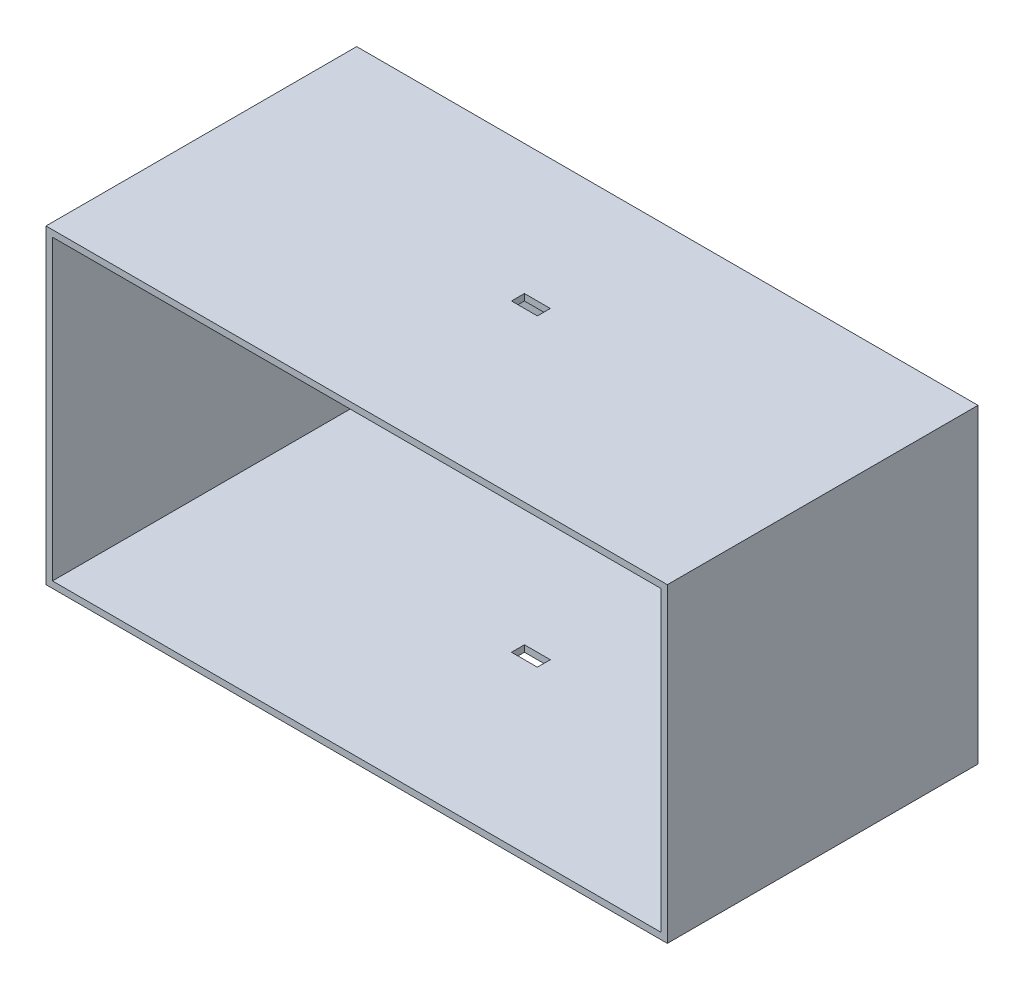
ISO-10303-21;
HEADER;
FILE_DESCRIPTION(('STEP AP214'),'2;1');
FILE_NAME('part.step','',(''),(''),'','','');
FILE_SCHEMA(('AUTOMOTIVE_DESIGN { 1 0 10303 214 1 1 1 1 }'));
ENDSEC;
DATA;
#1=APPLICATION_CONTEXT('core data for automotive mechanical design processes');
#2=APPLICATION_PROTOCOL_DEFINITION('international standard','automotive_design',2000,#1);
#3=PRODUCT_CONTEXT('',#1,'mechanical');
#4=PRODUCT('Part','Part','',(#3));
#5=PRODUCT_RELATED_PRODUCT_CATEGORY('part','',(#4));
#6=PRODUCT_DEFINITION_FORMATION('','',#4);
#7=PRODUCT_DEFINITION_CONTEXT('part definition',#1,'design');
#8=PRODUCT_DEFINITION('design','',#6,#7);
#9=PRODUCT_DEFINITION_SHAPE('','',#8);
#10=(LENGTH_UNIT() NAMED_UNIT(*) SI_UNIT(.MILLI.,.METRE.));
#11=(NAMED_UNIT(*) PLANE_ANGLE_UNIT() SI_UNIT($,.RADIAN.));
#12=(NAMED_UNIT(*) SI_UNIT($,.STERADIAN.) SOLID_ANGLE_UNIT());
#13=UNCERTAINTY_MEASURE_WITH_UNIT(LENGTH_MEASURE(1.E-05),#10,'distance_accuracy_value','');
#14=(GEOMETRIC_REPRESENTATION_CONTEXT(3) GLOBAL_UNCERTAINTY_ASSIGNED_CONTEXT((#13)) GLOBAL_UNIT_ASSIGNED_CONTEXT((#10,
#11,#12)) REPRESENTATION_CONTEXT('',''));
#15=CARTESIAN_POINT('',(0.,0.,0.));
#16=DIRECTION('',(0.,0.,1.));
#17=DIRECTION('',(1.,0.,0.));
#18=AXIS2_PLACEMENT_3D('',#15,#16,#17);
#19=CARTESIAN_POINT('',(0.,0.,152.4));
#20=DIRECTION('',(0.,0.,-1.));
#21=DIRECTION('',(-1.,0.,0.));
#22=AXIS2_PLACEMENT_3D('',#19,#20,#21);
#23=PLANE('',#22);
#24=DIRECTION('',(0.,-1.,0.));
#25=VECTOR('',#24,1.);
#26=CARTESIAN_POINT('',(0.,0.,152.4));
#27=LINE('',#26,#25);
#28=CARTESIAN_POINT('',(0.,152.4,152.4));
#29=VERTEX_POINT('',#28);
#30=CARTESIAN_POINT('',(0.,0.,152.4));
#31=VERTEX_POINT('',#30);
#32=EDGE_CURVE('E272',#29,#31,#27,.T.);
#33=ORIENTED_EDGE('',*,*,#32,.T.);
#34=DIRECTION('',(1.,0.,0.));
#35=VECTOR('',#34,1.);
#36=CARTESIAN_POINT('',(0.,0.,152.4));
#37=LINE('',#36,#35);
#38=CARTESIAN_POINT('',(304.8,0.,152.4));
#39=VERTEX_POINT('',#38);
#40=EDGE_CURVE('E280',#31,#39,#37,.T.);
#41=ORIENTED_EDGE('',*,*,#40,.T.);
#42=DIRECTION('',(0.,1.,0.));
#43=VECTOR('',#42,1.);
#44=CARTESIAN_POINT('',(304.8,0.,152.4));
#45=LINE('',#44,#43);
#46=CARTESIAN_POINT('',(304.8,152.4,152.4));
#47=VERTEX_POINT('',#46);
#48=EDGE_CURVE('E282',#39,#47,#45,.T.);
#49=ORIENTED_EDGE('',*,*,#48,.T.);
#50=DIRECTION('',(-1.,0.,0.));
#51=VECTOR('',#50,1.);
#52=CARTESIAN_POINT('',(0.,152.4,152.4));
#53=LINE('',#52,#51);
#54=EDGE_CURVE('E281',#47,#29,#53,.T.);
#55=ORIENTED_EDGE('',*,*,#54,.T.);
#56=EDGE_LOOP('',(#33,#41,#49,#55));
#57=FACE_BOUND('',#56,.T.);
#58=DIRECTION('',(0.,-1.,0.));
#59=VECTOR('',#58,1.);
#60=CARTESIAN_POINT('',(3.175,0.,152.4));
#61=LINE('',#60,#59);
#62=CARTESIAN_POINT('',(3.175,149.225,152.4));
#63=VERTEX_POINT('',#62);
#64=CARTESIAN_POINT('',(3.175,3.175,152.4));
#65=VERTEX_POINT('',#64);
#66=EDGE_CURVE('E261',#63,#65,#61,.T.);
#67=ORIENTED_EDGE('',*,*,#66,.F.);
#68=DIRECTION('',(-1.,0.,0.));
#69=VECTOR('',#68,1.);
#70=CARTESIAN_POINT('',(0.,149.225,152.4));
#71=LINE('',#70,#69);
#72=CARTESIAN_POINT('',(301.625,149.225,152.4));
#73=VERTEX_POINT('',#72);
#74=EDGE_CURVE('E247',#73,#63,#71,.T.);
#75=ORIENTED_EDGE('',*,*,#74,.F.);
#76=DIRECTION('',(0.,1.,0.));
#77=VECTOR('',#76,1.);
#78=CARTESIAN_POINT('',(301.625,0.,152.4));
#79=LINE('',#78,#77);
#80=CARTESIAN_POINT('',(301.625,3.175,152.4));
#81=VERTEX_POINT('',#80);
#82=EDGE_CURVE('E270',#81,#73,#79,.T.);
#83=ORIENTED_EDGE('',*,*,#82,.F.);
#84=DIRECTION('',(1.,0.,0.));
#85=VECTOR('',#84,1.);
#86=CARTESIAN_POINT('',(0.,3.175,152.4));
#87=LINE('',#86,#85);
#88=EDGE_CURVE('E262',#65,#81,#87,.T.);
#89=ORIENTED_EDGE('',*,*,#88,.F.);
#90=EDGE_LOOP('',(#67,#75,#83,#89));
#91=FACE_BOUND('',#90,.T.);
#92=ADVANCED_FACE('F44',(#57,#91),#23,.F.);
#93=CARTESIAN_POINT('',(0.,0.,152.4));
#94=DIRECTION('',(1.,0.,0.));
#95=DIRECTION('',(0.,0.,-1.));
#96=AXIS2_PLACEMENT_3D('',#93,#94,#95);
#97=PLANE('',#96);
#98=DIRECTION('',(0.,-1.,0.));
#99=VECTOR('',#98,1.);
#100=CARTESIAN_POINT('',(0.,0.,0.));
#101=LINE('',#100,#99);
#102=CARTESIAN_POINT('',(0.,152.4,0.));
#103=VERTEX_POINT('',#102);
#104=CARTESIAN_POINT('',(0.,0.,0.));
#105=VERTEX_POINT('',#104);
#106=EDGE_CURVE('E239',#103,#105,#101,.T.);
#107=ORIENTED_EDGE('',*,*,#106,.T.);
#108=DIRECTION('',(0.,0.,-1.));
#109=VECTOR('',#108,1.);
#110=CARTESIAN_POINT('',(0.,0.,152.4));
#111=LINE('',#110,#109);
#112=EDGE_CURVE('E309',#31,#105,#111,.T.);
#113=ORIENTED_EDGE('',*,*,#112,.F.);
#114=ORIENTED_EDGE('',*,*,#32,.F.);
#115=DIRECTION('',(0.,0.,-1.));
#116=VECTOR('',#115,1.);
#117=CARTESIAN_POINT('',(0.,152.4,152.4));
#118=LINE('',#117,#116);
#119=EDGE_CURVE('E290',#29,#103,#118,.T.);
#120=ORIENTED_EDGE('',*,*,#119,.T.);
#121=EDGE_LOOP('',(#107,#113,#114,#120));
#122=FACE_BOUND('',#121,.T.);
#123=ADVANCED_FACE('F50',(#122),#97,.F.);
#124=CARTESIAN_POINT('',(0.,0.,152.4));
#125=DIRECTION('',(0.,1.,0.));
#126=DIRECTION('',(0.,0.,1.));
#127=AXIS2_PLACEMENT_3D('',#124,#125,#126);
#128=PLANE('',#127);
#129=DIRECTION('',(1.,0.,0.));
#130=VECTOR('',#129,1.);
#131=CARTESIAN_POINT('',(146.05,0.,63.754));
#132=LINE('',#131,#130);
#133=CARTESIAN_POINT('',(146.05,0.,63.754));
#134=VERTEX_POINT('',#133);
#135=CARTESIAN_POINT('',(158.75,0.,63.754));
#136=VERTEX_POINT('',#135);
#137=EDGE_CURVE('E200',#134,#136,#132,.T.);
#138=ORIENTED_EDGE('',*,*,#137,.F.);
#139=DIRECTION('',(0.,0.,-1.));
#140=VECTOR('',#139,1.);
#141=CARTESIAN_POINT('',(146.05,0.,70.104));
#142=LINE('',#141,#140);
#143=CARTESIAN_POINT('',(146.05,0.,70.104));
#144=VERTEX_POINT('',#143);
#145=EDGE_CURVE('E62',#144,#134,#142,.T.);
#146=ORIENTED_EDGE('',*,*,#145,.F.);
#147=DIRECTION('',(-1.,0.,0.));
#148=VECTOR('',#147,1.);
#149=CARTESIAN_POINT('',(146.05,0.,70.104));
#150=LINE('',#149,#148);
#151=CARTESIAN_POINT('',(158.75,0.,70.104));
#152=VERTEX_POINT('',#151);
#153=EDGE_CURVE('E187',#152,#144,#150,.T.);
#154=ORIENTED_EDGE('',*,*,#153,.F.);
#155=DIRECTION('',(0.,0.,1.));
#156=VECTOR('',#155,1.);
#157=CARTESIAN_POINT('',(158.75,0.,70.104));
#158=LINE('',#157,#156);
#159=EDGE_CURVE('E188',#136,#152,#158,.T.);
#160=ORIENTED_EDGE('',*,*,#159,.F.);
#161=EDGE_LOOP('',(#138,#146,#154,#160));
#162=FACE_BOUND('',#161,.T.);
#163=DIRECTION('',(1.,0.,0.));
#164=VECTOR('',#163,1.);
#165=CARTESIAN_POINT('',(0.,0.,0.));
#166=LINE('',#165,#164);
#167=CARTESIAN_POINT('',(304.8,0.,0.));
#168=VERTEX_POINT('',#167);
#169=EDGE_CURVE('E292',#105,#168,#166,.T.);
#170=ORIENTED_EDGE('',*,*,#169,.T.);
#171=DIRECTION('',(0.,0.,-1.));
#172=VECTOR('',#171,1.);
#173=CARTESIAN_POINT('',(304.8,0.,152.4));
#174=LINE('',#173,#172);
#175=EDGE_CURVE('E308',#39,#168,#174,.T.);
#176=ORIENTED_EDGE('',*,*,#175,.F.);
#177=ORIENTED_EDGE('',*,*,#40,.F.);
#178=ORIENTED_EDGE('',*,*,#112,.T.);
#179=EDGE_LOOP('',(#170,#176,#177,#178));
#180=FACE_BOUND('',#179,.T.);
#181=ADVANCED_FACE('F348',(#162,#180),#128,.F.);
#182=CARTESIAN_POINT('',(304.8,0.,152.4));
#183=DIRECTION('',(-1.,0.,0.));
#184=DIRECTION('',(0.,0.,1.));
#185=AXIS2_PLACEMENT_3D('',#182,#183,#184);
#186=PLANE('',#185);
#187=DIRECTION('',(0.,1.,0.));
#188=VECTOR('',#187,1.);
#189=CARTESIAN_POINT('',(304.8,0.,0.));
#190=LINE('',#189,#188);
#191=CARTESIAN_POINT('',(304.8,152.4,0.));
#192=VERTEX_POINT('',#191);
#193=EDGE_CURVE('E294',#168,#192,#190,.T.);
#194=ORIENTED_EDGE('',*,*,#193,.T.);
#195=DIRECTION('',(0.,0.,-1.));
#196=VECTOR('',#195,1.);
#197=CARTESIAN_POINT('',(304.8,152.4,152.4));
#198=LINE('',#197,#196);
#199=EDGE_CURVE('E305',#47,#192,#198,.T.);
#200=ORIENTED_EDGE('',*,*,#199,.F.);
#201=ORIENTED_EDGE('',*,*,#48,.F.);
#202=ORIENTED_EDGE('',*,*,#175,.T.);
#203=EDGE_LOOP('',(#194,#200,#201,#202));
#204=FACE_BOUND('',#203,.T.);
#205=ADVANCED_FACE('F362',(#204),#186,.F.);
#206=CARTESIAN_POINT('',(0.,152.4,152.4));
#207=DIRECTION('',(0.,-1.,0.));
#208=DIRECTION('',(0.,0.,-1.));
#209=AXIS2_PLACEMENT_3D('',#206,#207,#208);
#210=PLANE('',#209);
#211=DIRECTION('',(-1.,0.,0.));
#212=VECTOR('',#211,1.);
#213=CARTESIAN_POINT('',(146.05,152.4,70.104));
#214=LINE('',#213,#212);
#215=CARTESIAN_POINT('',(158.75,152.4,70.104));
#216=VERTEX_POINT('',#215);
#217=CARTESIAN_POINT('',(146.05,152.4,70.104));
#218=VERTEX_POINT('',#217);
#219=EDGE_CURVE('E184',#216,#218,#214,.T.);
#220=ORIENTED_EDGE('',*,*,#219,.T.);
#221=DIRECTION('',(0.,0.,-1.));
#222=VECTOR('',#221,1.);
#223=CARTESIAN_POINT('',(146.05,152.4,70.104));
#224=LINE('',#223,#222);
#225=CARTESIAN_POINT('',(146.05,152.4,63.754));
#226=VERTEX_POINT('',#225);
#227=EDGE_CURVE('E164',#218,#226,#224,.T.);
#228=ORIENTED_EDGE('',*,*,#227,.T.);
#229=DIRECTION('',(1.,0.,0.));
#230=VECTOR('',#229,1.);
#231=CARTESIAN_POINT('',(146.05,152.4,63.754));
#232=LINE('',#231,#230);
#233=CARTESIAN_POINT('',(158.75,152.4,63.754));
#234=VERTEX_POINT('',#233);
#235=EDGE_CURVE('E173',#226,#234,#232,.T.);
#236=ORIENTED_EDGE('',*,*,#235,.T.);
#237=DIRECTION('',(0.,0.,1.));
#238=VECTOR('',#237,1.);
#239=CARTESIAN_POINT('',(158.75,152.4,70.104));
#240=LINE('',#239,#238);
#241=EDGE_CURVE('E69',#234,#216,#240,.T.);
#242=ORIENTED_EDGE('',*,*,#241,.T.);
#243=EDGE_LOOP('',(#220,#228,#236,#242));
#244=FACE_BOUND('',#243,.T.);
#245=DIRECTION('',(-1.,0.,0.));
#246=VECTOR('',#245,1.);
#247=CARTESIAN_POINT('',(0.,152.4,0.));
#248=LINE('',#247,#246);
#249=EDGE_CURVE('E279',#192,#103,#248,.T.);
#250=ORIENTED_EDGE('',*,*,#249,.T.);
#251=ORIENTED_EDGE('',*,*,#119,.F.);
#252=ORIENTED_EDGE('',*,*,#54,.F.);
#253=ORIENTED_EDGE('',*,*,#199,.T.);
#254=EDGE_LOOP('',(#250,#251,#252,#253));
#255=FACE_BOUND('',#254,.T.);
#256=ADVANCED_FACE('F182',(#244,#255),#210,.F.);
#257=CARTESIAN_POINT('',(0.,0.,0.));
#258=DIRECTION('',(0.,0.,-1.));
#259=DIRECTION('',(-1.,0.,0.));
#260=AXIS2_PLACEMENT_3D('',#257,#258,#259);
#261=PLANE('',#260);
#262=ORIENTED_EDGE('',*,*,#106,.F.);
#263=ORIENTED_EDGE('',*,*,#249,.F.);
#264=ORIENTED_EDGE('',*,*,#193,.F.);
#265=ORIENTED_EDGE('',*,*,#169,.F.);
#266=EDGE_LOOP('',(#262,#263,#264,#265));
#267=FACE_BOUND('',#266,.T.);
#268=ADVANCED_FACE('F357',(#267),#261,.T.);
#269=CARTESIAN_POINT('',(3.175,0.,152.4));
#270=DIRECTION('',(1.,0.,0.));
#271=DIRECTION('',(0.,0.,-1.));
#272=AXIS2_PLACEMENT_3D('',#269,#270,#271);
#273=PLANE('',#272);
#274=DIRECTION('',(0.,-1.,0.));
#275=VECTOR('',#274,1.);
#276=CARTESIAN_POINT('',(3.175,0.,3.175));
#277=LINE('',#276,#275);
#278=CARTESIAN_POINT('',(3.175,149.225,3.175));
#279=VERTEX_POINT('',#278);
#280=CARTESIAN_POINT('',(3.175,3.175,3.175));
#281=VERTEX_POINT('',#280);
#282=EDGE_CURVE('E228',#279,#281,#277,.T.);
#283=ORIENTED_EDGE('',*,*,#282,.F.);
#284=DIRECTION('',(0.,0.,-1.));
#285=VECTOR('',#284,1.);
#286=CARTESIAN_POINT('',(3.175,149.225,152.4));
#287=LINE('',#286,#285);
#288=EDGE_CURVE('E242',#63,#279,#287,.T.);
#289=ORIENTED_EDGE('',*,*,#288,.F.);
#290=ORIENTED_EDGE('',*,*,#66,.T.);
#291=DIRECTION('',(0.,0.,-1.));
#292=VECTOR('',#291,1.);
#293=CARTESIAN_POINT('',(3.175,3.175,152.4));
#294=LINE('',#293,#292);
#295=EDGE_CURVE('E231',#65,#281,#294,.T.);
#296=ORIENTED_EDGE('',*,*,#295,.T.);
#297=EDGE_LOOP('',(#283,#289,#290,#296));
#298=FACE_BOUND('',#297,.T.);
#299=ADVANCED_FACE('F358',(#298),#273,.T.);
#300=CARTESIAN_POINT('',(0.,3.175,152.4));
#301=DIRECTION('',(0.,1.,0.));
#302=DIRECTION('',(0.,0.,1.));
#303=AXIS2_PLACEMENT_3D('',#300,#301,#302);
#304=PLANE('',#303);
#305=DIRECTION('',(0.,0.,1.));
#306=VECTOR('',#305,1.);
#307=CARTESIAN_POINT('',(146.05,3.175,152.399999999999));
#308=LINE('',#307,#306);
#309=CARTESIAN_POINT('',(146.05,3.17500000000007,63.754));
#310=VERTEX_POINT('',#309);
#311=CARTESIAN_POINT('',(146.05,3.17500000000007,70.104));
#312=VERTEX_POINT('',#311);
#313=EDGE_CURVE('E230',#310,#312,#308,.T.);
#314=ORIENTED_EDGE('',*,*,#313,.F.);
#315=DIRECTION('',(-1.,0.,0.));
#316=VECTOR('',#315,1.);
#317=CARTESIAN_POINT('',(0.,3.175,63.754));
#318=LINE('',#317,#316);
#319=CARTESIAN_POINT('',(158.75,3.175,63.754));
#320=VERTEX_POINT('',#319);
#321=EDGE_CURVE('E207',#320,#310,#318,.T.);
#322=ORIENTED_EDGE('',*,*,#321,.F.);
#323=DIRECTION('',(0.,0.,-1.));
#324=VECTOR('',#323,1.);
#325=CARTESIAN_POINT('',(158.75,3.175,152.400000000001));
#326=LINE('',#325,#324);
#327=CARTESIAN_POINT('',(158.75,3.17500000000007,70.104));
#328=VERTEX_POINT('',#327);
#329=EDGE_CURVE('E219',#328,#320,#326,.T.);
#330=ORIENTED_EDGE('',*,*,#329,.F.);
#331=DIRECTION('',(1.,0.,0.));
#332=VECTOR('',#331,1.);
#333=CARTESIAN_POINT('',(0.,3.175,70.104));
#334=LINE('',#333,#332);
#335=EDGE_CURVE('E221',#312,#328,#334,.T.);
#336=ORIENTED_EDGE('',*,*,#335,.F.);
#337=EDGE_LOOP('',(#314,#322,#330,#336));
#338=FACE_BOUND('',#337,.T.);
#339=DIRECTION('',(1.,0.,0.));
#340=VECTOR('',#339,1.);
#341=CARTESIAN_POINT('',(0.,3.175,3.175));
#342=LINE('',#341,#340);
#343=CARTESIAN_POINT('',(301.625,3.175,3.175));
#344=VERTEX_POINT('',#343);
#345=EDGE_CURVE('E234',#281,#344,#342,.T.);
#346=ORIENTED_EDGE('',*,*,#345,.F.);
#347=ORIENTED_EDGE('',*,*,#295,.F.);
#348=ORIENTED_EDGE('',*,*,#88,.T.);
#349=DIRECTION('',(0.,0.,-1.));
#350=VECTOR('',#349,1.);
#351=CARTESIAN_POINT('',(301.625,3.175,152.4));
#352=LINE('',#351,#350);
#353=EDGE_CURVE('E238',#81,#344,#352,.T.);
#354=ORIENTED_EDGE('',*,*,#353,.T.);
#355=EDGE_LOOP('',(#346,#347,#348,#354));
#356=FACE_BOUND('',#355,.T.);
#357=ADVANCED_FACE('F398',(#338,#356),#304,.T.);
#358=CARTESIAN_POINT('',(301.625,0.,152.4));
#359=DIRECTION('',(-1.,0.,0.));
#360=DIRECTION('',(0.,0.,1.));
#361=AXIS2_PLACEMENT_3D('',#358,#359,#360);
#362=PLANE('',#361);
#363=DIRECTION('',(0.,1.,0.));
#364=VECTOR('',#363,1.);
#365=CARTESIAN_POINT('',(301.625,0.,3.175));
#366=LINE('',#365,#364);
#367=CARTESIAN_POINT('',(301.625,149.225,3.175));
#368=VERTEX_POINT('',#367);
#369=EDGE_CURVE('E249',#344,#368,#366,.T.);
#370=ORIENTED_EDGE('',*,*,#369,.F.);
#371=ORIENTED_EDGE('',*,*,#353,.F.);
#372=ORIENTED_EDGE('',*,*,#82,.T.);
#373=DIRECTION('',(0.,0.,-1.));
#374=VECTOR('',#373,1.);
#375=CARTESIAN_POINT('',(301.625,149.225,152.4));
#376=LINE('',#375,#374);
#377=EDGE_CURVE('E243',#73,#368,#376,.T.);
#378=ORIENTED_EDGE('',*,*,#377,.T.);
#379=EDGE_LOOP('',(#370,#371,#372,#378));
#380=FACE_BOUND('',#379,.T.);
#381=ADVANCED_FACE('F402',(#380),#362,.T.);
#382=CARTESIAN_POINT('',(0.,149.225,152.4));
#383=DIRECTION('',(0.,-1.,0.));
#384=DIRECTION('',(0.,0.,-1.));
#385=AXIS2_PLACEMENT_3D('',#382,#383,#384);
#386=PLANE('',#385);
#387=DIRECTION('',(0.,0.,-1.));
#388=VECTOR('',#387,1.);
#389=CARTESIAN_POINT('',(146.05,149.225,152.399999999999));
#390=LINE('',#389,#388);
#391=CARTESIAN_POINT('',(146.05,149.225,70.104));
#392=VERTEX_POINT('',#391);
#393=CARTESIAN_POINT('',(146.05,149.225,63.754));
#394=VERTEX_POINT('',#393);
#395=EDGE_CURVE('E11',#392,#394,#390,.T.);
#396=ORIENTED_EDGE('',*,*,#395,.F.);
#397=DIRECTION('',(-1.,0.,0.));
#398=VECTOR('',#397,1.);
#399=CARTESIAN_POINT('',(0.,149.225,70.104));
#400=LINE('',#399,#398);
#401=CARTESIAN_POINT('',(158.75,149.225,70.104));
#402=VERTEX_POINT('',#401);
#403=EDGE_CURVE('E53',#402,#392,#400,.T.);
#404=ORIENTED_EDGE('',*,*,#403,.F.);
#405=DIRECTION('',(0.,0.,1.));
#406=VECTOR('',#405,1.);
#407=CARTESIAN_POINT('',(158.75,149.225,152.400000000001));
#408=LINE('',#407,#406);
#409=CARTESIAN_POINT('',(158.75,149.225,63.754));
#410=VERTEX_POINT('',#409);
#411=EDGE_CURVE('E320',#410,#402,#408,.T.);
#412=ORIENTED_EDGE('',*,*,#411,.F.);
#413=DIRECTION('',(1.,0.,0.));
#414=VECTOR('',#413,1.);
#415=CARTESIAN_POINT('',(0.,149.225,63.754));
#416=LINE('',#415,#414);
#417=EDGE_CURVE('E314',#394,#410,#416,.T.);
#418=ORIENTED_EDGE('',*,*,#417,.F.);
#419=EDGE_LOOP('',(#396,#404,#412,#418));
#420=FACE_BOUND('',#419,.T.);
#421=DIRECTION('',(-1.,0.,0.));
#422=VECTOR('',#421,1.);
#423=CARTESIAN_POINT('',(0.,149.225,3.175));
#424=LINE('',#423,#422);
#425=EDGE_CURVE('E254',#368,#279,#424,.T.);
#426=ORIENTED_EDGE('',*,*,#425,.F.);
#427=ORIENTED_EDGE('',*,*,#377,.F.);
#428=ORIENTED_EDGE('',*,*,#74,.T.);
#429=ORIENTED_EDGE('',*,*,#288,.T.);
#430=EDGE_LOOP('',(#426,#427,#428,#429));
#431=FACE_BOUND('',#430,.T.);
#432=ADVANCED_FACE('F324',(#420,#431),#386,.T.);
#433=CARTESIAN_POINT('',(0.,0.,3.175));
#434=DIRECTION('',(0.,0.,-1.));
#435=DIRECTION('',(-1.,0.,0.));
#436=AXIS2_PLACEMENT_3D('',#433,#434,#435);
#437=PLANE('',#436);
#438=ORIENTED_EDGE('',*,*,#282,.T.);
#439=ORIENTED_EDGE('',*,*,#345,.T.);
#440=ORIENTED_EDGE('',*,*,#369,.T.);
#441=ORIENTED_EDGE('',*,*,#425,.T.);
#442=EDGE_LOOP('',(#438,#439,#440,#441));
#443=FACE_BOUND('',#442,.T.);
#444=ADVANCED_FACE('F340',(#443),#437,.F.);
#445=CARTESIAN_POINT('',(146.05,152.4,63.754));
#446=DIRECTION('',(0.,0.,-1.));
#447=DIRECTION('',(-1.,0.,0.));
#448=AXIS2_PLACEMENT_3D('',#445,#446,#447);
#449=PLANE('',#448);
#450=ORIENTED_EDGE('',*,*,#417,.T.);
#451=DIRECTION('',(0.,-1.,0.));
#452=VECTOR('',#451,1.);
#453=CARTESIAN_POINT('',(158.75,152.4,63.754));
#454=LINE('',#453,#452);
#455=EDGE_CURVE('E180',#234,#410,#454,.T.);
#456=ORIENTED_EDGE('',*,*,#455,.F.);
#457=ORIENTED_EDGE('',*,*,#235,.F.);
#458=DIRECTION('',(0.,-1.,0.));
#459=VECTOR('',#458,1.);
#460=CARTESIAN_POINT('',(146.05,152.4,63.754));
#461=LINE('',#460,#459);
#462=EDGE_CURVE('E159',#226,#394,#461,.T.);
#463=ORIENTED_EDGE('',*,*,#462,.T.);
#464=EDGE_LOOP('',(#450,#456,#457,#463));
#465=FACE_BOUND('',#464,.T.);
#466=ADVANCED_FACE('F177',(#465),#449,.F.);
#467=CARTESIAN_POINT('',(158.75,152.4,70.104));
#468=DIRECTION('',(1.,0.,0.));
#469=DIRECTION('',(0.,0.,-1.));
#470=AXIS2_PLACEMENT_3D('',#467,#468,#469);
#471=PLANE('',#470);
#472=ORIENTED_EDGE('',*,*,#411,.T.);
#473=DIRECTION('',(0.,-1.,0.));
#474=VECTOR('',#473,1.);
#475=CARTESIAN_POINT('',(158.75,152.4,70.104));
#476=LINE('',#475,#474);
#477=EDGE_CURVE('E211',#216,#402,#476,.T.);
#478=ORIENTED_EDGE('',*,*,#477,.F.);
#479=ORIENTED_EDGE('',*,*,#241,.F.);
#480=ORIENTED_EDGE('',*,*,#455,.T.);
#481=EDGE_LOOP('',(#472,#478,#479,#480));
#482=FACE_BOUND('',#481,.T.);
#483=ADVANCED_FACE('F330',(#482),#471,.F.);
#484=CARTESIAN_POINT('',(146.05,152.4,70.104));
#485=DIRECTION('',(0.,0.,1.));
#486=DIRECTION('',(1.,0.,0.));
#487=AXIS2_PLACEMENT_3D('',#484,#485,#486);
#488=PLANE('',#487);
#489=ORIENTED_EDGE('',*,*,#403,.T.);
#490=DIRECTION('',(0.,-1.,0.));
#491=VECTOR('',#490,1.);
#492=CARTESIAN_POINT('',(146.05,152.4,70.104));
#493=LINE('',#492,#491);
#494=EDGE_CURVE('E206',#218,#392,#493,.T.);
#495=ORIENTED_EDGE('',*,*,#494,.F.);
#496=ORIENTED_EDGE('',*,*,#219,.F.);
#497=ORIENTED_EDGE('',*,*,#477,.T.);
#498=EDGE_LOOP('',(#489,#495,#496,#497));
#499=FACE_BOUND('',#498,.T.);
#500=ADVANCED_FACE('F325',(#499),#488,.F.);
#501=CARTESIAN_POINT('',(146.05,152.4,70.104));
#502=DIRECTION('',(-1.,0.,0.));
#503=DIRECTION('',(0.,0.,1.));
#504=AXIS2_PLACEMENT_3D('',#501,#502,#503);
#505=PLANE('',#504);
#506=ORIENTED_EDGE('',*,*,#395,.T.);
#507=ORIENTED_EDGE('',*,*,#462,.F.);
#508=ORIENTED_EDGE('',*,*,#227,.F.);
#509=ORIENTED_EDGE('',*,*,#494,.T.);
#510=EDGE_LOOP('',(#506,#507,#508,#509));
#511=FACE_BOUND('',#510,.T.);
#512=ADVANCED_FACE('F165',(#511),#505,.F.);
#513=ORIENTED_EDGE('',*,*,#313,.T.);
#514=EDGE_CURVE('E209',#312,#144,#493,.T.);
#515=ORIENTED_EDGE('',*,*,#514,.T.);
#516=ORIENTED_EDGE('',*,*,#145,.T.);
#517=EDGE_CURVE('E175',#310,#134,#461,.T.);
#518=ORIENTED_EDGE('',*,*,#517,.F.);
#519=EDGE_LOOP('',(#513,#515,#516,#518));
#520=FACE_BOUND('',#519,.T.);
#521=ADVANCED_FACE('F395',(#520),#505,.F.);
#522=ORIENTED_EDGE('',*,*,#335,.T.);
#523=EDGE_CURVE('E214',#328,#152,#476,.T.);
#524=ORIENTED_EDGE('',*,*,#523,.T.);
#525=ORIENTED_EDGE('',*,*,#153,.T.);
#526=ORIENTED_EDGE('',*,*,#514,.F.);
#527=EDGE_LOOP('',(#522,#524,#525,#526));
#528=FACE_BOUND('',#527,.T.);
#529=ADVANCED_FACE('F337',(#528),#488,.F.);
#530=ORIENTED_EDGE('',*,*,#329,.T.);
#531=EDGE_CURVE('E172',#320,#136,#454,.T.);
#532=ORIENTED_EDGE('',*,*,#531,.T.);
#533=ORIENTED_EDGE('',*,*,#159,.T.);
#534=ORIENTED_EDGE('',*,*,#523,.F.);
#535=EDGE_LOOP('',(#530,#532,#533,#534));
#536=FACE_BOUND('',#535,.T.);
#537=ADVANCED_FACE('F329',(#536),#471,.F.);
#538=ORIENTED_EDGE('',*,*,#321,.T.);
#539=ORIENTED_EDGE('',*,*,#517,.T.);
#540=ORIENTED_EDGE('',*,*,#137,.T.);
#541=ORIENTED_EDGE('',*,*,#531,.F.);
#542=EDGE_LOOP('',(#538,#539,#540,#541));
#543=FACE_BOUND('',#542,.T.);
#544=ADVANCED_FACE('F336',(#543),#449,.F.);
#545=CLOSED_SHELL('',(#92,#123,#181,#205,#256,#268,#299,#357,#381,#432,#444,#466,#483,#500,#512,
#521,#529,#537,#544));
#546=MANIFOLD_SOLID_BREP('B2',#545);
#547=ADVANCED_BREP_SHAPE_REPRESENTATION('',(#18,#546),#14);
#548=SHAPE_DEFINITION_REPRESENTATION(#9,#547);
ENDSEC;
END-ISO-10303-21;
